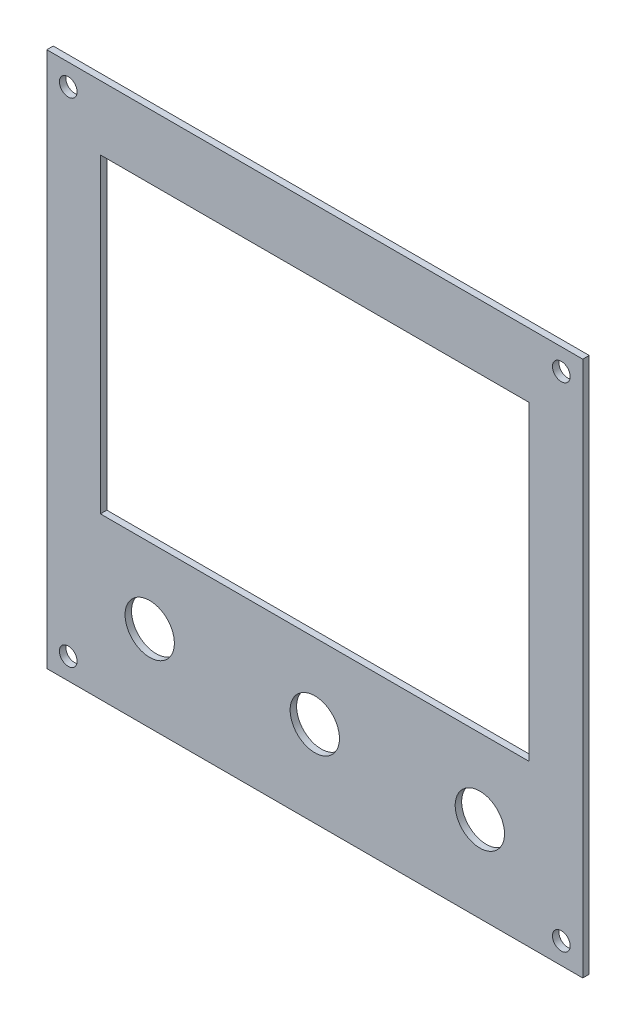
ISO-10303-21;
HEADER;
FILE_DESCRIPTION(('STEP AP214'),'2;1');
FILE_NAME('part.step','',(''),(''),'','','');
FILE_SCHEMA(('AUTOMOTIVE_DESIGN { 1 0 10303 214 1 1 1 1 }'));
ENDSEC;
DATA;
#1=APPLICATION_CONTEXT('core data for automotive mechanical design processes');
#2=APPLICATION_PROTOCOL_DEFINITION('international standard','automotive_design',2000,#1);
#3=PRODUCT_CONTEXT('',#1,'mechanical');
#4=PRODUCT('Part','Part','',(#3));
#5=PRODUCT_RELATED_PRODUCT_CATEGORY('part','',(#4));
#6=PRODUCT_DEFINITION_FORMATION('','',#4);
#7=PRODUCT_DEFINITION_CONTEXT('part definition',#1,'design');
#8=PRODUCT_DEFINITION('design','',#6,#7);
#9=PRODUCT_DEFINITION_SHAPE('','',#8);
#10=(LENGTH_UNIT() NAMED_UNIT(*) SI_UNIT(.MILLI.,.METRE.));
#11=(NAMED_UNIT(*) PLANE_ANGLE_UNIT() SI_UNIT($,.RADIAN.));
#12=(NAMED_UNIT(*) SI_UNIT($,.STERADIAN.) SOLID_ANGLE_UNIT());
#13=UNCERTAINTY_MEASURE_WITH_UNIT(LENGTH_MEASURE(1.E-05),#10,'distance_accuracy_value','');
#14=(GEOMETRIC_REPRESENTATION_CONTEXT(3) GLOBAL_UNCERTAINTY_ASSIGNED_CONTEXT((#13)) GLOBAL_UNIT_ASSIGNED_CONTEXT((#10,
#11,#12)) REPRESENTATION_CONTEXT('',''));
#15=CARTESIAN_POINT('',(0.,0.,0.));
#16=DIRECTION('',(0.,0.,1.));
#17=DIRECTION('',(1.,0.,0.));
#18=AXIS2_PLACEMENT_3D('',#15,#16,#17);
#19=CARTESIAN_POINT('',(0.,0.,3.));
#20=DIRECTION('',(0.,0.,-1.));
#21=DIRECTION('',(-1.,0.,0.));
#22=AXIS2_PLACEMENT_3D('',#19,#20,#21);
#23=PLANE('',#22);
#24=DIRECTION('',(0.,1.,0.));
#25=VECTOR('',#24,1.);
#26=CARTESIAN_POINT('',(125.,-125.,3.));
#27=LINE('',#26,#25);
#28=CARTESIAN_POINT('',(125.,-125.,3.));
#29=VERTEX_POINT('',#28);
#30=CARTESIAN_POINT('',(125.,125.,3.));
#31=VERTEX_POINT('',#30);
#32=EDGE_CURVE('E156',#29,#31,#27,.T.);
#33=ORIENTED_EDGE('',*,*,#32,.T.);
#34=DIRECTION('',(-1.,0.,0.));
#35=VECTOR('',#34,1.);
#36=CARTESIAN_POINT('',(-125.,125.,3.));
#37=LINE('',#36,#35);
#38=CARTESIAN_POINT('',(-125.,125.,3.));
#39=VERTEX_POINT('',#38);
#40=EDGE_CURVE('E160',#31,#39,#37,.T.);
#41=ORIENTED_EDGE('',*,*,#40,.T.);
#42=DIRECTION('',(0.,-1.,0.));
#43=VECTOR('',#42,1.);
#44=CARTESIAN_POINT('',(-125.,-125.,3.));
#45=LINE('',#44,#43);
#46=CARTESIAN_POINT('',(-125.,-125.,3.));
#47=VERTEX_POINT('',#46);
#48=EDGE_CURVE('E164',#39,#47,#45,.T.);
#49=ORIENTED_EDGE('',*,*,#48,.T.);
#50=DIRECTION('',(1.,0.,0.));
#51=VECTOR('',#50,1.);
#52=CARTESIAN_POINT('',(-125.,-125.,3.));
#53=LINE('',#52,#51);
#54=EDGE_CURVE('E167',#47,#29,#53,.T.);
#55=ORIENTED_EDGE('',*,*,#54,.T.);
#56=EDGE_LOOP('',(#33,#41,#49,#55));
#57=FACE_BOUND('',#56,.T.);
#58=DIRECTION('',(0.,1.,0.));
#59=VECTOR('',#58,1.);
#60=CARTESIAN_POINT('',(100.,-50.,3.));
#61=LINE('',#60,#59);
#62=CARTESIAN_POINT('',(100.,-50.,3.));
#63=VERTEX_POINT('',#62);
#64=CARTESIAN_POINT('',(100.,95.,3.));
#65=VERTEX_POINT('',#64);
#66=EDGE_CURVE('E105',#63,#65,#61,.T.);
#67=ORIENTED_EDGE('',*,*,#66,.F.);
#68=DIRECTION('',(1.,0.,0.));
#69=VECTOR('',#68,1.);
#70=CARTESIAN_POINT('',(-100.,-50.,3.));
#71=LINE('',#70,#69);
#72=CARTESIAN_POINT('',(-100.,-50.,3.));
#73=VERTEX_POINT('',#72);
#74=EDGE_CURVE('E132',#73,#63,#71,.T.);
#75=ORIENTED_EDGE('',*,*,#74,.F.);
#76=DIRECTION('',(0.,-1.,0.));
#77=VECTOR('',#76,1.);
#78=CARTESIAN_POINT('',(-100.,-50.,3.));
#79=LINE('',#78,#77);
#80=CARTESIAN_POINT('',(-100.,95.,3.));
#81=VERTEX_POINT('',#80);
#82=EDGE_CURVE('E128',#81,#73,#79,.T.);
#83=ORIENTED_EDGE('',*,*,#82,.F.);
#84=DIRECTION('',(-1.,0.,0.));
#85=VECTOR('',#84,1.);
#86=CARTESIAN_POINT('',(-100.,95.,3.));
#87=LINE('',#86,#85);
#88=EDGE_CURVE('E114',#65,#81,#87,.T.);
#89=ORIENTED_EDGE('',*,*,#88,.F.);
#90=EDGE_LOOP('',(#67,#75,#83,#89));
#91=FACE_BOUND('',#90,.T.);
#92=CARTESIAN_POINT('',(-115.,115.,3.));
#93=DIRECTION('',(0.,0.,1.));
#94=DIRECTION('',(1.,0.,0.));
#95=AXIS2_PLACEMENT_3D('',#92,#93,#94);
#96=CIRCLE('',#95,4.125);
#97=CARTESIAN_POINT('',(-110.875,115.,3.));
#98=VERTEX_POINT('',#97);
#99=EDGE_CURVE('E140',#98,#98,#96,.T.);
#100=ORIENTED_EDGE('',*,*,#99,.F.);
#101=EDGE_LOOP('',(#100));
#102=FACE_BOUND('',#101,.T.);
#103=CARTESIAN_POINT('',(115.,115.,3.));
#104=DIRECTION('',(0.,0.,1.));
#105=DIRECTION('',(1.,0.,0.));
#106=AXIS2_PLACEMENT_3D('',#103,#104,#105);
#107=CIRCLE('',#106,4.125);
#108=CARTESIAN_POINT('',(119.125,115.,3.));
#109=VERTEX_POINT('',#108);
#110=EDGE_CURVE('E319',#109,#109,#107,.T.);
#111=ORIENTED_EDGE('',*,*,#110,.F.);
#112=EDGE_LOOP('',(#111));
#113=FACE_BOUND('',#112,.T.);
#114=CARTESIAN_POINT('',(115.,-115.,3.));
#115=DIRECTION('',(0.,0.,1.));
#116=DIRECTION('',(1.,0.,0.));
#117=AXIS2_PLACEMENT_3D('',#114,#115,#116);
#118=CIRCLE('',#117,4.125);
#119=CARTESIAN_POINT('',(119.125,-115.,3.));
#120=VERTEX_POINT('',#119);
#121=EDGE_CURVE('E311',#120,#120,#118,.T.);
#122=ORIENTED_EDGE('',*,*,#121,.F.);
#123=EDGE_LOOP('',(#122));
#124=FACE_BOUND('',#123,.T.);
#125=CARTESIAN_POINT('',(-115.,-115.,3.));
#126=DIRECTION('',(0.,0.,1.));
#127=DIRECTION('',(1.,0.,0.));
#128=AXIS2_PLACEMENT_3D('',#125,#126,#127);
#129=CIRCLE('',#128,4.125);
#130=CARTESIAN_POINT('',(-110.875,-115.,3.));
#131=VERTEX_POINT('',#130);
#132=EDGE_CURVE('E303',#131,#131,#129,.T.);
#133=ORIENTED_EDGE('',*,*,#132,.F.);
#134=EDGE_LOOP('',(#133));
#135=FACE_BOUND('',#134,.T.);
#136=CARTESIAN_POINT('',(-77.,-85.,3.));
#137=DIRECTION('',(0.,0.,1.));
#138=DIRECTION('',(1.,0.,0.));
#139=AXIS2_PLACEMENT_3D('',#136,#137,#138);
#140=CIRCLE('',#139,11.5);
#141=CARTESIAN_POINT('',(-65.5,-85.,3.));
#142=VERTEX_POINT('',#141);
#143=EDGE_CURVE('E295',#142,#142,#140,.T.);
#144=ORIENTED_EDGE('',*,*,#143,.F.);
#145=EDGE_LOOP('',(#144));
#146=FACE_BOUND('',#145,.T.);
#147=CARTESIAN_POINT('',(0.,-85.,3.));
#148=DIRECTION('',(0.,0.,1.));
#149=DIRECTION('',(1.,0.,0.));
#150=AXIS2_PLACEMENT_3D('',#147,#148,#149);
#151=CIRCLE('',#150,11.5);
#152=CARTESIAN_POINT('',(11.5,-85.,3.));
#153=VERTEX_POINT('',#152);
#154=EDGE_CURVE('E287',#153,#153,#151,.T.);
#155=ORIENTED_EDGE('',*,*,#154,.F.);
#156=EDGE_LOOP('',(#155));
#157=FACE_BOUND('',#156,.T.);
#158=CARTESIAN_POINT('',(77.,-85.,3.));
#159=DIRECTION('',(0.,0.,1.));
#160=DIRECTION('',(1.,0.,0.));
#161=AXIS2_PLACEMENT_3D('',#158,#159,#160);
#162=CIRCLE('',#161,11.5);
#163=CARTESIAN_POINT('',(88.5,-85.,3.));
#164=VERTEX_POINT('',#163);
#165=EDGE_CURVE('E276',#164,#164,#162,.T.);
#166=ORIENTED_EDGE('',*,*,#165,.F.);
#167=EDGE_LOOP('',(#166));
#168=FACE_BOUND('',#167,.T.);
#169=ADVANCED_FACE('F39',(#57,#91,#102,#113,#124,#135,#146,#157,#168),#23,.F.);
#170=CARTESIAN_POINT('',(0.,0.,0.));
#171=DIRECTION('',(0.,0.,-1.));
#172=DIRECTION('',(-1.,0.,0.));
#173=AXIS2_PLACEMENT_3D('',#170,#171,#172);
#174=PLANE('',#173);
#175=CARTESIAN_POINT('',(0.,-85.,0.));
#176=DIRECTION('',(0.,0.,1.));
#177=DIRECTION('',(1.,0.,0.));
#178=AXIS2_PLACEMENT_3D('',#175,#176,#177);
#179=CIRCLE('',#178,11.5);
#180=CARTESIAN_POINT('',(11.5,-85.,0.));
#181=VERTEX_POINT('',#180);
#182=EDGE_CURVE('E284',#181,#181,#179,.T.);
#183=ORIENTED_EDGE('',*,*,#182,.T.);
#184=EDGE_LOOP('',(#183));
#185=FACE_BOUND('',#184,.T.);
#186=CARTESIAN_POINT('',(-115.,-115.,0.));
#187=DIRECTION('',(0.,0.,1.));
#188=DIRECTION('',(1.,0.,0.));
#189=AXIS2_PLACEMENT_3D('',#186,#187,#188);
#190=CIRCLE('',#189,4.125);
#191=CARTESIAN_POINT('',(-110.875,-115.,0.));
#192=VERTEX_POINT('',#191);
#193=EDGE_CURVE('E299',#192,#192,#190,.T.);
#194=ORIENTED_EDGE('',*,*,#193,.T.);
#195=EDGE_LOOP('',(#194));
#196=FACE_BOUND('',#195,.T.);
#197=CARTESIAN_POINT('',(115.,115.,0.));
#198=DIRECTION('',(0.,0.,1.));
#199=DIRECTION('',(1.,0.,0.));
#200=AXIS2_PLACEMENT_3D('',#197,#198,#199);
#201=CIRCLE('',#200,4.125);
#202=CARTESIAN_POINT('',(119.125,115.,0.));
#203=VERTEX_POINT('',#202);
#204=EDGE_CURVE('E315',#203,#203,#201,.T.);
#205=ORIENTED_EDGE('',*,*,#204,.T.);
#206=EDGE_LOOP('',(#205));
#207=FACE_BOUND('',#206,.T.);
#208=DIRECTION('',(1.,0.,0.));
#209=VECTOR('',#208,1.);
#210=CARTESIAN_POINT('',(-100.,-50.,0.));
#211=LINE('',#210,#209);
#212=CARTESIAN_POINT('',(-100.,-50.,0.));
#213=VERTEX_POINT('',#212);
#214=CARTESIAN_POINT('',(100.,-50.,0.));
#215=VERTEX_POINT('',#214);
#216=EDGE_CURVE('E115',#213,#215,#211,.T.);
#217=ORIENTED_EDGE('',*,*,#216,.T.);
#218=DIRECTION('',(0.,1.,0.));
#219=VECTOR('',#218,1.);
#220=CARTESIAN_POINT('',(100.,-50.,0.));
#221=LINE('',#220,#219);
#222=CARTESIAN_POINT('',(100.,95.,0.));
#223=VERTEX_POINT('',#222);
#224=EDGE_CURVE('E63',#215,#223,#221,.T.);
#225=ORIENTED_EDGE('',*,*,#224,.T.);
#226=DIRECTION('',(-1.,0.,0.));
#227=VECTOR('',#226,1.);
#228=CARTESIAN_POINT('',(-100.,95.,0.));
#229=LINE('',#228,#227);
#230=CARTESIAN_POINT('',(-100.,95.,0.));
#231=VERTEX_POINT('',#230);
#232=EDGE_CURVE('E121',#223,#231,#229,.T.);
#233=ORIENTED_EDGE('',*,*,#232,.T.);
#234=DIRECTION('',(0.,-1.,0.));
#235=VECTOR('',#234,1.);
#236=CARTESIAN_POINT('',(-100.,-50.,0.));
#237=LINE('',#236,#235);
#238=EDGE_CURVE('E143',#231,#213,#237,.T.);
#239=ORIENTED_EDGE('',*,*,#238,.T.);
#240=EDGE_LOOP('',(#217,#225,#233,#239));
#241=FACE_BOUND('',#240,.T.);
#242=DIRECTION('',(0.,1.,0.));
#243=VECTOR('',#242,1.);
#244=CARTESIAN_POINT('',(125.,-125.,0.));
#245=LINE('',#244,#243);
#246=CARTESIAN_POINT('',(125.,-125.,0.));
#247=VERTEX_POINT('',#246);
#248=CARTESIAN_POINT('',(125.,125.,0.));
#249=VERTEX_POINT('',#248);
#250=EDGE_CURVE('E123',#247,#249,#245,.T.);
#251=ORIENTED_EDGE('',*,*,#250,.F.);
#252=DIRECTION('',(1.,0.,0.));
#253=VECTOR('',#252,1.);
#254=CARTESIAN_POINT('',(-125.,-125.,0.));
#255=LINE('',#254,#253);
#256=CARTESIAN_POINT('',(-125.,-125.,0.));
#257=VERTEX_POINT('',#256);
#258=EDGE_CURVE('E161',#257,#247,#255,.T.);
#259=ORIENTED_EDGE('',*,*,#258,.F.);
#260=DIRECTION('',(0.,-1.,0.));
#261=VECTOR('',#260,1.);
#262=CARTESIAN_POINT('',(-125.,-125.,0.));
#263=LINE('',#262,#261);
#264=CARTESIAN_POINT('',(-125.,125.,0.));
#265=VERTEX_POINT('',#264);
#266=EDGE_CURVE('E177',#265,#257,#263,.T.);
#267=ORIENTED_EDGE('',*,*,#266,.F.);
#268=DIRECTION('',(-1.,0.,0.));
#269=VECTOR('',#268,1.);
#270=CARTESIAN_POINT('',(-125.,125.,0.));
#271=LINE('',#270,#269);
#272=EDGE_CURVE('E174',#249,#265,#271,.T.);
#273=ORIENTED_EDGE('',*,*,#272,.F.);
#274=EDGE_LOOP('',(#251,#259,#267,#273));
#275=FACE_BOUND('',#274,.T.);
#276=CARTESIAN_POINT('',(-115.,115.,0.));
#277=DIRECTION('',(0.,0.,1.));
#278=DIRECTION('',(1.,0.,0.));
#279=AXIS2_PLACEMENT_3D('',#276,#277,#278);
#280=CIRCLE('',#279,4.125);
#281=CARTESIAN_POINT('',(-110.875,115.,0.));
#282=VERTEX_POINT('',#281);
#283=EDGE_CURVE('E323',#282,#282,#280,.T.);
#284=ORIENTED_EDGE('',*,*,#283,.T.);
#285=EDGE_LOOP('',(#284));
#286=FACE_BOUND('',#285,.T.);
#287=CARTESIAN_POINT('',(115.,-115.,0.));
#288=DIRECTION('',(0.,0.,1.));
#289=DIRECTION('',(1.,0.,0.));
#290=AXIS2_PLACEMENT_3D('',#287,#288,#289);
#291=CIRCLE('',#290,4.125);
#292=CARTESIAN_POINT('',(119.125,-115.,0.));
#293=VERTEX_POINT('',#292);
#294=EDGE_CURVE('E307',#293,#293,#291,.T.);
#295=ORIENTED_EDGE('',*,*,#294,.T.);
#296=EDGE_LOOP('',(#295));
#297=FACE_BOUND('',#296,.T.);
#298=CARTESIAN_POINT('',(-77.,-85.,0.));
#299=DIRECTION('',(0.,0.,1.));
#300=DIRECTION('',(1.,0.,0.));
#301=AXIS2_PLACEMENT_3D('',#298,#299,#300);
#302=CIRCLE('',#301,11.5);
#303=CARTESIAN_POINT('',(-65.5,-85.,0.));
#304=VERTEX_POINT('',#303);
#305=EDGE_CURVE('E291',#304,#304,#302,.T.);
#306=ORIENTED_EDGE('',*,*,#305,.T.);
#307=EDGE_LOOP('',(#306));
#308=FACE_BOUND('',#307,.T.);
#309=CARTESIAN_POINT('',(77.,-85.,0.));
#310=DIRECTION('',(0.,0.,1.));
#311=DIRECTION('',(1.,0.,0.));
#312=AXIS2_PLACEMENT_3D('',#309,#310,#311);
#313=CIRCLE('',#312,11.5);
#314=CARTESIAN_POINT('',(88.5,-85.,0.));
#315=VERTEX_POINT('',#314);
#316=EDGE_CURVE('E279',#315,#315,#313,.T.);
#317=ORIENTED_EDGE('',*,*,#316,.T.);
#318=EDGE_LOOP('',(#317));
#319=FACE_BOUND('',#318,.T.);
#320=ADVANCED_FACE('F200',(#185,#196,#207,#241,#275,#286,#297,#308,#319),#174,.T.);
#321=CARTESIAN_POINT('',(125.,-125.,3.));
#322=DIRECTION('',(-1.,0.,0.));
#323=DIRECTION('',(0.,0.,1.));
#324=AXIS2_PLACEMENT_3D('',#321,#322,#323);
#325=PLANE('',#324);
#326=ORIENTED_EDGE('',*,*,#250,.T.);
#327=DIRECTION('',(0.,0.,-1.));
#328=VECTOR('',#327,1.);
#329=CARTESIAN_POINT('',(125.,125.,3.));
#330=LINE('',#329,#328);
#331=EDGE_CURVE('E11',#31,#249,#330,.T.);
#332=ORIENTED_EDGE('',*,*,#331,.F.);
#333=ORIENTED_EDGE('',*,*,#32,.F.);
#334=DIRECTION('',(0.,0.,-1.));
#335=VECTOR('',#334,1.);
#336=CARTESIAN_POINT('',(125.,-125.,3.));
#337=LINE('',#336,#335);
#338=EDGE_CURVE('E170',#29,#247,#337,.T.);
#339=ORIENTED_EDGE('',*,*,#338,.T.);
#340=EDGE_LOOP('',(#326,#332,#333,#339));
#341=FACE_BOUND('',#340,.T.);
#342=ADVANCED_FACE('F41',(#341),#325,.F.);
#343=CARTESIAN_POINT('',(-125.,125.,3.));
#344=DIRECTION('',(0.,-1.,0.));
#345=DIRECTION('',(0.,0.,-1.));
#346=AXIS2_PLACEMENT_3D('',#343,#344,#345);
#347=PLANE('',#346);
#348=ORIENTED_EDGE('',*,*,#272,.T.);
#349=DIRECTION('',(0.,0.,-1.));
#350=VECTOR('',#349,1.);
#351=CARTESIAN_POINT('',(-125.,125.,3.));
#352=LINE('',#351,#350);
#353=EDGE_CURVE('E48',#39,#265,#352,.T.);
#354=ORIENTED_EDGE('',*,*,#353,.F.);
#355=ORIENTED_EDGE('',*,*,#40,.F.);
#356=ORIENTED_EDGE('',*,*,#331,.T.);
#357=EDGE_LOOP('',(#348,#354,#355,#356));
#358=FACE_BOUND('',#357,.T.);
#359=ADVANCED_FACE('F210',(#358),#347,.F.);
#360=CARTESIAN_POINT('',(-125.,-125.,3.));
#361=DIRECTION('',(1.,0.,0.));
#362=DIRECTION('',(0.,0.,-1.));
#363=AXIS2_PLACEMENT_3D('',#360,#361,#362);
#364=PLANE('',#363);
#365=ORIENTED_EDGE('',*,*,#266,.T.);
#366=DIRECTION('',(0.,0.,-1.));
#367=VECTOR('',#366,1.);
#368=CARTESIAN_POINT('',(-125.,-125.,3.));
#369=LINE('',#368,#367);
#370=EDGE_CURVE('E185',#47,#257,#369,.T.);
#371=ORIENTED_EDGE('',*,*,#370,.F.);
#372=ORIENTED_EDGE('',*,*,#48,.F.);
#373=ORIENTED_EDGE('',*,*,#353,.T.);
#374=EDGE_LOOP('',(#365,#371,#372,#373));
#375=FACE_BOUND('',#374,.T.);
#376=ADVANCED_FACE('F194',(#375),#364,.F.);
#377=CARTESIAN_POINT('',(-125.,-125.,3.));
#378=DIRECTION('',(0.,1.,0.));
#379=DIRECTION('',(0.,0.,1.));
#380=AXIS2_PLACEMENT_3D('',#377,#378,#379);
#381=PLANE('',#380);
#382=ORIENTED_EDGE('',*,*,#258,.T.);
#383=ORIENTED_EDGE('',*,*,#338,.F.);
#384=ORIENTED_EDGE('',*,*,#54,.F.);
#385=ORIENTED_EDGE('',*,*,#370,.T.);
#386=EDGE_LOOP('',(#382,#383,#384,#385));
#387=FACE_BOUND('',#386,.T.);
#388=ADVANCED_FACE('F204',(#387),#381,.F.);
#389=CARTESIAN_POINT('',(100.,-50.,3.));
#390=DIRECTION('',(-1.,0.,0.));
#391=DIRECTION('',(0.,0.,1.));
#392=AXIS2_PLACEMENT_3D('',#389,#390,#391);
#393=PLANE('',#392);
#394=ORIENTED_EDGE('',*,*,#224,.F.);
#395=DIRECTION('',(0.,0.,-1.));
#396=VECTOR('',#395,1.);
#397=CARTESIAN_POINT('',(100.,-50.,3.));
#398=LINE('',#397,#396);
#399=EDGE_CURVE('E109',#63,#215,#398,.T.);
#400=ORIENTED_EDGE('',*,*,#399,.F.);
#401=ORIENTED_EDGE('',*,*,#66,.T.);
#402=DIRECTION('',(0.,0.,-1.));
#403=VECTOR('',#402,1.);
#404=CARTESIAN_POINT('',(100.,95.,3.));
#405=LINE('',#404,#403);
#406=EDGE_CURVE('E108',#65,#223,#405,.T.);
#407=ORIENTED_EDGE('',*,*,#406,.T.);
#408=EDGE_LOOP('',(#394,#400,#401,#407));
#409=FACE_BOUND('',#408,.T.);
#410=ADVANCED_FACE('F107',(#409),#393,.T.);
#411=CARTESIAN_POINT('',(-100.,95.,3.));
#412=DIRECTION('',(0.,-1.,0.));
#413=DIRECTION('',(0.,0.,-1.));
#414=AXIS2_PLACEMENT_3D('',#411,#412,#413);
#415=PLANE('',#414);
#416=ORIENTED_EDGE('',*,*,#232,.F.);
#417=ORIENTED_EDGE('',*,*,#406,.F.);
#418=ORIENTED_EDGE('',*,*,#88,.T.);
#419=DIRECTION('',(0.,0.,-1.));
#420=VECTOR('',#419,1.);
#421=CARTESIAN_POINT('',(-100.,95.,3.));
#422=LINE('',#421,#420);
#423=EDGE_CURVE('E124',#81,#231,#422,.T.);
#424=ORIENTED_EDGE('',*,*,#423,.T.);
#425=EDGE_LOOP('',(#416,#417,#418,#424));
#426=FACE_BOUND('',#425,.T.);
#427=ADVANCED_FACE('F118',(#426),#415,.T.);
#428=CARTESIAN_POINT('',(-100.,-50.,3.));
#429=DIRECTION('',(1.,0.,0.));
#430=DIRECTION('',(0.,0.,-1.));
#431=AXIS2_PLACEMENT_3D('',#428,#429,#430);
#432=PLANE('',#431);
#433=ORIENTED_EDGE('',*,*,#238,.F.);
#434=ORIENTED_EDGE('',*,*,#423,.F.);
#435=ORIENTED_EDGE('',*,*,#82,.T.);
#436=DIRECTION('',(0.,0.,-1.));
#437=VECTOR('',#436,1.);
#438=CARTESIAN_POINT('',(-100.,-50.,3.));
#439=LINE('',#438,#437);
#440=EDGE_CURVE('E55',#73,#213,#439,.T.);
#441=ORIENTED_EDGE('',*,*,#440,.T.);
#442=EDGE_LOOP('',(#433,#434,#435,#441));
#443=FACE_BOUND('',#442,.T.);
#444=ADVANCED_FACE('F234',(#443),#432,.T.);
#445=CARTESIAN_POINT('',(-100.,-50.,3.));
#446=DIRECTION('',(0.,1.,0.));
#447=DIRECTION('',(0.,0.,1.));
#448=AXIS2_PLACEMENT_3D('',#445,#446,#447);
#449=PLANE('',#448);
#450=ORIENTED_EDGE('',*,*,#216,.F.);
#451=ORIENTED_EDGE('',*,*,#440,.F.);
#452=ORIENTED_EDGE('',*,*,#74,.T.);
#453=ORIENTED_EDGE('',*,*,#399,.T.);
#454=EDGE_LOOP('',(#450,#451,#452,#453));
#455=FACE_BOUND('',#454,.T.);
#456=ADVANCED_FACE('F238',(#455),#449,.T.);
#457=CARTESIAN_POINT('',(-115.,115.,3.));
#458=DIRECTION('',(0.,0.,-1.));
#459=DIRECTION('',(-1.,0.,0.));
#460=AXIS2_PLACEMENT_3D('',#457,#458,#459);
#461=CYLINDRICAL_SURFACE('',#460,4.125);
#462=ORIENTED_EDGE('',*,*,#99,.T.);
#463=EDGE_LOOP('',(#462));
#464=FACE_BOUND('',#463,.T.);
#465=ORIENTED_EDGE('',*,*,#283,.F.);
#466=EDGE_LOOP('',(#465));
#467=FACE_BOUND('',#466,.T.);
#468=ADVANCED_FACE('F244',(#464,#467),#461,.F.);
#469=CARTESIAN_POINT('',(115.,115.,3.));
#470=DIRECTION('',(0.,0.,-1.));
#471=DIRECTION('',(-1.,0.,0.));
#472=AXIS2_PLACEMENT_3D('',#469,#470,#471);
#473=CYLINDRICAL_SURFACE('',#472,4.125);
#474=ORIENTED_EDGE('',*,*,#110,.T.);
#475=EDGE_LOOP('',(#474));
#476=FACE_BOUND('',#475,.T.);
#477=ORIENTED_EDGE('',*,*,#204,.F.);
#478=EDGE_LOOP('',(#477));
#479=FACE_BOUND('',#478,.T.);
#480=ADVANCED_FACE('F247',(#476,#479),#473,.F.);
#481=CARTESIAN_POINT('',(115.,-115.,3.));
#482=DIRECTION('',(0.,0.,-1.));
#483=DIRECTION('',(-1.,0.,0.));
#484=AXIS2_PLACEMENT_3D('',#481,#482,#483);
#485=CYLINDRICAL_SURFACE('',#484,4.125);
#486=ORIENTED_EDGE('',*,*,#121,.T.);
#487=EDGE_LOOP('',(#486));
#488=FACE_BOUND('',#487,.T.);
#489=ORIENTED_EDGE('',*,*,#294,.F.);
#490=EDGE_LOOP('',(#489));
#491=FACE_BOUND('',#490,.T.);
#492=ADVANCED_FACE('F251',(#488,#491),#485,.F.);
#493=CARTESIAN_POINT('',(-115.,-115.,3.));
#494=DIRECTION('',(0.,0.,-1.));
#495=DIRECTION('',(-1.,0.,0.));
#496=AXIS2_PLACEMENT_3D('',#493,#494,#495);
#497=CYLINDRICAL_SURFACE('',#496,4.125);
#498=ORIENTED_EDGE('',*,*,#132,.T.);
#499=EDGE_LOOP('',(#498));
#500=FACE_BOUND('',#499,.T.);
#501=ORIENTED_EDGE('',*,*,#193,.F.);
#502=EDGE_LOOP('',(#501));
#503=FACE_BOUND('',#502,.T.);
#504=ADVANCED_FACE('F255',(#500,#503),#497,.F.);
#505=CARTESIAN_POINT('',(-77.,-85.,3.));
#506=DIRECTION('',(0.,0.,-1.));
#507=DIRECTION('',(-1.,0.,0.));
#508=AXIS2_PLACEMENT_3D('',#505,#506,#507);
#509=CYLINDRICAL_SURFACE('',#508,11.5);
#510=ORIENTED_EDGE('',*,*,#143,.T.);
#511=EDGE_LOOP('',(#510));
#512=FACE_BOUND('',#511,.T.);
#513=ORIENTED_EDGE('',*,*,#305,.F.);
#514=EDGE_LOOP('',(#513));
#515=FACE_BOUND('',#514,.T.);
#516=ADVANCED_FACE('F259',(#512,#515),#509,.F.);
#517=CARTESIAN_POINT('',(0.,-85.,3.));
#518=DIRECTION('',(0.,0.,-1.));
#519=DIRECTION('',(-1.,0.,0.));
#520=AXIS2_PLACEMENT_3D('',#517,#518,#519);
#521=CYLINDRICAL_SURFACE('',#520,11.5);
#522=ORIENTED_EDGE('',*,*,#154,.T.);
#523=EDGE_LOOP('',(#522));
#524=FACE_BOUND('',#523,.T.);
#525=ORIENTED_EDGE('',*,*,#182,.F.);
#526=EDGE_LOOP('',(#525));
#527=FACE_BOUND('',#526,.T.);
#528=ADVANCED_FACE('F263',(#524,#527),#521,.F.);
#529=CARTESIAN_POINT('',(77.,-85.,3.));
#530=DIRECTION('',(0.,0.,-1.));
#531=DIRECTION('',(-1.,0.,0.));
#532=AXIS2_PLACEMENT_3D('',#529,#530,#531);
#533=CYLINDRICAL_SURFACE('',#532,11.5);
#534=ORIENTED_EDGE('',*,*,#165,.T.);
#535=EDGE_LOOP('',(#534));
#536=FACE_BOUND('',#535,.T.);
#537=ORIENTED_EDGE('',*,*,#316,.F.);
#538=EDGE_LOOP('',(#537));
#539=FACE_BOUND('',#538,.T.);
#540=ADVANCED_FACE('F267',(#536,#539),#533,.F.);
#541=CLOSED_SHELL('',(#169,#320,#342,#359,#376,#388,#410,#427,#444,#456,#468,#480,#492,#504,
#516,#528,#540));
#542=MANIFOLD_SOLID_BREP('B2',#541);
#543=ADVANCED_BREP_SHAPE_REPRESENTATION('',(#18,#542),#14);
#544=SHAPE_DEFINITION_REPRESENTATION(#9,#543);
ENDSEC;
END-ISO-10303-21;
